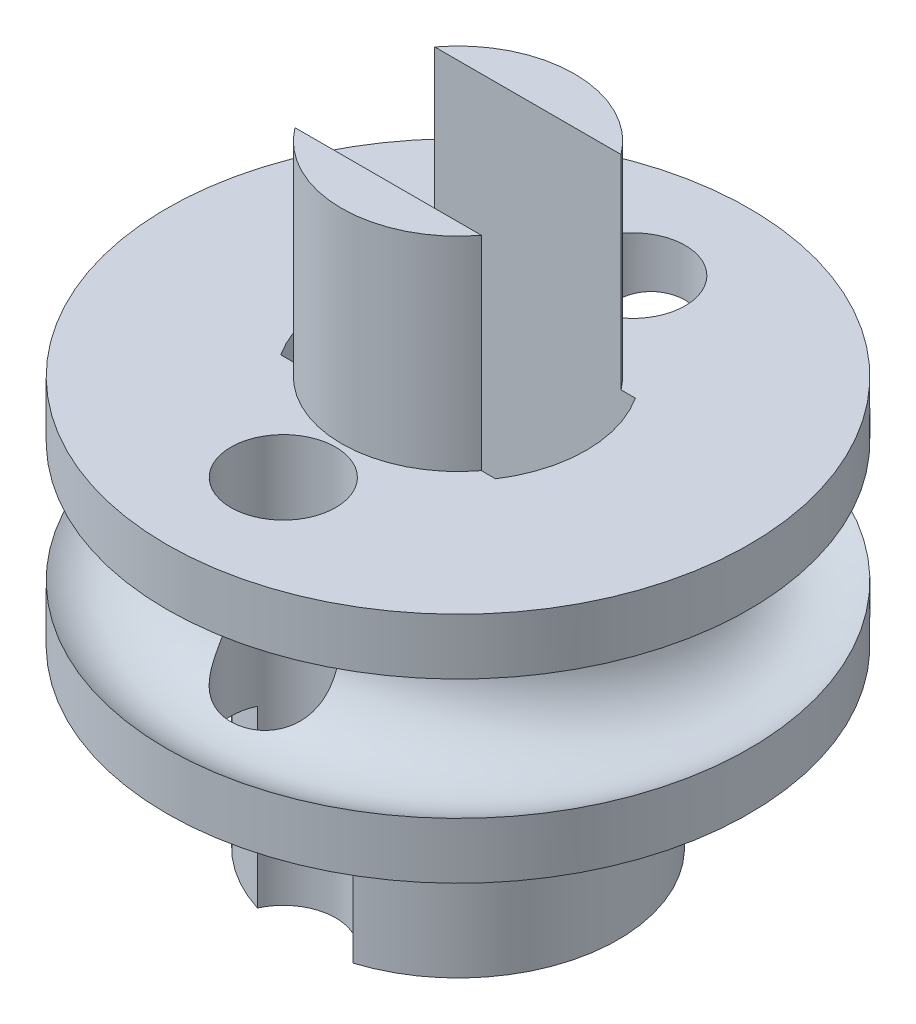
ISO-10303-21;
HEADER;
FILE_DESCRIPTION(('STEP AP214'),'2;1');
FILE_NAME('part.step','',(''),(''),'','','');
FILE_SCHEMA(('AUTOMOTIVE_DESIGN { 1 0 10303 214 1 1 1 1 }'));
ENDSEC;
DATA;
#1=APPLICATION_CONTEXT('core data for automotive mechanical design processes');
#2=APPLICATION_PROTOCOL_DEFINITION('international standard','automotive_design',2000,#1);
#3=PRODUCT_CONTEXT('',#1,'mechanical');
#4=PRODUCT('Part','Part','',(#3));
#5=PRODUCT_RELATED_PRODUCT_CATEGORY('part','',(#4));
#6=PRODUCT_DEFINITION_FORMATION('','',#4);
#7=PRODUCT_DEFINITION_CONTEXT('part definition',#1,'design');
#8=PRODUCT_DEFINITION('design','',#6,#7);
#9=PRODUCT_DEFINITION_SHAPE('','',#8);
#10=(LENGTH_UNIT() NAMED_UNIT(*) SI_UNIT(.MILLI.,.METRE.));
#11=(NAMED_UNIT(*) PLANE_ANGLE_UNIT() SI_UNIT($,.RADIAN.));
#12=(NAMED_UNIT(*) SI_UNIT($,.STERADIAN.) SOLID_ANGLE_UNIT());
#13=UNCERTAINTY_MEASURE_WITH_UNIT(LENGTH_MEASURE(1.E-05),#10,'distance_accuracy_value','');
#14=(GEOMETRIC_REPRESENTATION_CONTEXT(3) GLOBAL_UNCERTAINTY_ASSIGNED_CONTEXT((#13)) GLOBAL_UNIT_ASSIGNED_CONTEXT((#10,
#11,#12)) REPRESENTATION_CONTEXT('',''));
#15=CARTESIAN_POINT('',(0.,0.,0.));
#16=DIRECTION('',(0.,0.,1.));
#17=DIRECTION('',(1.,0.,0.));
#18=AXIS2_PLACEMENT_3D('',#15,#16,#17);
#19=CARTESIAN_POINT('',(0.,3.,0.));
#20=DIRECTION('',(0.,1.,0.));
#21=DIRECTION('',(0.,0.,1.));
#22=AXIS2_PLACEMENT_3D('',#19,#20,#21);
#23=PLANE('',#22);
#24=CARTESIAN_POINT('',(0.,3.,0.));
#25=DIRECTION('',(0.,1.,0.));
#26=DIRECTION('',(0.,0.,1.));
#27=AXIS2_PLACEMENT_3D('',#24,#25,#26);
#28=CIRCLE('',#27,5.);
#29=CARTESIAN_POINT('',(0.,3.,5.));
#30=VERTEX_POINT('',#29);
#31=EDGE_CURVE('E268',#30,#30,#28,.T.);
#32=ORIENTED_EDGE('',*,*,#31,.F.);
#33=EDGE_LOOP('',(#32));
#34=FACE_BOUND('',#33,.T.);
#35=CARTESIAN_POINT('',(0.,3.,3.));
#36=DIRECTION('',(0.,-1.,0.));
#37=DIRECTION('',(0.,0.,-1.));
#38=AXIS2_PLACEMENT_3D('',#35,#36,#37);
#39=CIRCLE('',#38,0.9);
#40=CARTESIAN_POINT('',(0.818344259092032,3.,2.62541666666667));
#41=VERTEX_POINT('',#40);
#42=CARTESIAN_POINT('',(-0.818344259092034,3.,2.62541666666667));
#43=VERTEX_POINT('',#42);
#44=EDGE_CURVE('E162',#41,#43,#39,.T.);
#45=ORIENTED_EDGE('',*,*,#44,.F.);
#46=CARTESIAN_POINT('',(0.,3.,0.));
#47=DIRECTION('',(0.,1.,0.));
#48=DIRECTION('',(0.,0.,1.));
#49=AXIS2_PLACEMENT_3D('',#46,#47,#48);
#50=CIRCLE('',#49,2.75);
#51=CARTESIAN_POINT('',(0.818344259092033,3.,-2.62541666666667));
#52=VERTEX_POINT('',#51);
#53=EDGE_CURVE('E176',#41,#52,#50,.T.);
#54=ORIENTED_EDGE('',*,*,#53,.T.);
#55=CARTESIAN_POINT('',(0.,3.,-3.));
#56=DIRECTION('',(0.,-1.,0.));
#57=DIRECTION('',(0.,0.,-1.));
#58=AXIS2_PLACEMENT_3D('',#55,#56,#57);
#59=CIRCLE('',#58,0.9);
#60=CARTESIAN_POINT('',(-0.818344259092033,3.,-2.62541666666667));
#61=VERTEX_POINT('',#60);
#62=EDGE_CURVE('E302',#61,#52,#59,.T.);
#63=ORIENTED_EDGE('',*,*,#62,.F.);
#64=EDGE_CURVE('E178',#61,#43,#50,.T.);
#65=ORIENTED_EDGE('',*,*,#64,.T.);
#66=EDGE_LOOP('',(#45,#54,#63,#65));
#67=FACE_BOUND('',#66,.T.);
#68=ADVANCED_FACE('F59',(#34,#67),#23,.F.);
#69=CARTESIAN_POINT('',(0.,0.,0.));
#70=DIRECTION('',(0.,1.,0.));
#71=DIRECTION('',(0.,0.,1.));
#72=AXIS2_PLACEMENT_3D('',#69,#70,#71);
#73=PLANE('',#72);
#74=CARTESIAN_POINT('',(0.,0.,3.));
#75=DIRECTION('',(0.,1.,0.));
#76=DIRECTION('',(0.,0.,1.));
#77=AXIS2_PLACEMENT_3D('',#74,#75,#76);
#78=CIRCLE('',#77,0.9);
#79=CARTESIAN_POINT('',(0.818344259092032,0.,2.62541666666667));
#80=VERTEX_POINT('',#79);
#81=CARTESIAN_POINT('',(-0.818344259092033,0.,2.62541666666667));
#82=VERTEX_POINT('',#81);
#83=EDGE_CURVE('E83',#80,#82,#78,.T.);
#84=ORIENTED_EDGE('',*,*,#83,.T.);
#85=CARTESIAN_POINT('',(0.,0.,0.));
#86=DIRECTION('',(0.,1.,0.));
#87=DIRECTION('',(0.,0.,1.));
#88=AXIS2_PLACEMENT_3D('',#85,#86,#87);
#89=CIRCLE('',#88,2.75);
#90=CARTESIAN_POINT('',(-0.818344259092033,0.,-2.62541666666667));
#91=VERTEX_POINT('',#90);
#92=EDGE_CURVE('E196',#91,#82,#89,.T.);
#93=ORIENTED_EDGE('',*,*,#92,.F.);
#94=CARTESIAN_POINT('',(0.,0.,-3.));
#95=DIRECTION('',(0.,1.,0.));
#96=DIRECTION('',(0.,0.,1.));
#97=AXIS2_PLACEMENT_3D('',#94,#95,#96);
#98=CIRCLE('',#97,0.9);
#99=CARTESIAN_POINT('',(0.818344259092033,0.,-2.62541666666667));
#100=VERTEX_POINT('',#99);
#101=EDGE_CURVE('E75',#91,#100,#98,.T.);
#102=ORIENTED_EDGE('',*,*,#101,.T.);
#103=EDGE_CURVE('E192',#80,#100,#89,.T.);
#104=ORIENTED_EDGE('',*,*,#103,.F.);
#105=EDGE_LOOP('',(#84,#93,#102,#104));
#106=FACE_BOUND('',#105,.T.);
#107=ADVANCED_FACE('F401',(#106),#73,.F.);
#108=CARTESIAN_POINT('',(0.,7.,0.));
#109=DIRECTION('',(0.,-1.,0.));
#110=DIRECTION('',(0.,0.,-1.));
#111=AXIS2_PLACEMENT_3D('',#108,#109,#110);
#112=CYLINDRICAL_SURFACE('',#111,2.75);
#113=DIRECTION('',(0.,-1.,0.));
#114=VECTOR('',#113,1.);
#115=CARTESIAN_POINT('',(-0.818344259092034,1.5,2.62541666666667));
#116=LINE('',#115,#114);
#117=EDGE_CURVE('E169',#82,#43,#116,.F.);
#118=ORIENTED_EDGE('',*,*,#117,.T.);
#119=ORIENTED_EDGE('',*,*,#64,.F.);
#120=DIRECTION('',(0.,-1.,0.));
#121=VECTOR('',#120,1.);
#122=CARTESIAN_POINT('',(-0.818344259092033,1.5,-2.62541666666667));
#123=LINE('',#122,#121);
#124=EDGE_CURVE('E290',#61,#91,#123,.T.);
#125=ORIENTED_EDGE('',*,*,#124,.T.);
#126=ORIENTED_EDGE('',*,*,#92,.T.);
#127=EDGE_LOOP('',(#118,#119,#125,#126));
#128=FACE_BOUND('',#127,.T.);
#129=ADVANCED_FACE('F61',(#128),#112,.T.);
#130=DIRECTION('',(0.,-1.,0.));
#131=VECTOR('',#130,1.);
#132=CARTESIAN_POINT('',(0.818344259092032,1.5,2.62541666666667));
#133=LINE('',#132,#131);
#134=EDGE_CURVE('E158',#41,#80,#133,.T.);
#135=ORIENTED_EDGE('',*,*,#134,.T.);
#136=ORIENTED_EDGE('',*,*,#103,.T.);
#137=DIRECTION('',(0.,-1.,0.));
#138=VECTOR('',#137,1.);
#139=CARTESIAN_POINT('',(0.818344259092033,1.5,-2.62541666666667));
#140=LINE('',#139,#138);
#141=EDGE_CURVE('E184',#100,#52,#140,.F.);
#142=ORIENTED_EDGE('',*,*,#141,.T.);
#143=ORIENTED_EDGE('',*,*,#53,.F.);
#144=EDGE_LOOP('',(#135,#136,#142,#143));
#145=FACE_BOUND('',#144,.T.);
#146=ADVANCED_FACE('F183',(#145),#112,.T.);
#147=CARTESIAN_POINT('',(0.,5.,0.));
#148=DIRECTION('',(0.,-1.,0.));
#149=DIRECTION('',(0.,0.,-1.));
#150=AXIS2_PLACEMENT_3D('',#147,#148,#149);
#151=TOROIDAL_SURFACE('',#150,4.3,1.25);
#152=CARTESIAN_POINT('',(-0.683529065477994,3.93225998657177,-3.58548105341402));
#153=CARTESIAN_POINT('',(-0.712384372251249,3.94911904604806,-3.5517874791948));
#154=CARTESIAN_POINT('',(-0.738160552704805,3.96839167932476,-3.5166141374605));
#155=CARTESIAN_POINT('',(-0.783223917138607,4.01217612628106,-3.4453574338248));
#156=CARTESIAN_POINT('',(-0.802505329037138,4.03669256881383,-3.40927329291961));
#157=CARTESIAN_POINT('',(-0.83485711744434,4.09086620262035,-3.33841930497334));
#158=CARTESIAN_POINT('',(-0.847946637716012,4.12050715693041,-3.30364571699467));
#159=CARTESIAN_POINT('',(-0.868918451931517,4.18455023754195,-3.23707072016033));
#160=CARTESIAN_POINT('',(-0.876799709231551,4.21895331004025,-3.20526990408088));
#161=CARTESIAN_POINT('',(-0.888917712896388,4.29370014679972,-3.14436519786418));
#162=CARTESIAN_POINT('',(-0.892945126023242,4.33425900699732,-3.1154855326065));
#163=CARTESIAN_POINT('',(-0.898160246728364,4.41894239135499,-3.06323645490398));
#164=CARTESIAN_POINT('',(-0.899346296623299,4.4630689814593,-3.03987026624564));
#165=CARTESIAN_POINT('',(-0.900309698064023,4.56184222321523,-2.99551307543839));
#166=CARTESIAN_POINT('',(-0.899808328626254,4.61698943363633,-2.97562954188469));
#167=CARTESIAN_POINT('',(-0.898404520797892,4.72960366652736,-2.94417975626337));
#168=CARTESIAN_POINT('',(-0.897501850711853,4.78707201167887,-2.93261831916625));
#169=CARTESIAN_POINT('',(-0.896192415170599,4.91096499371717,-2.91683840728801));
#170=CARTESIAN_POINT('',(-0.895869492729777,4.97754740700427,-2.91382823136743));
#171=CARTESIAN_POINT('',(-0.896311309223705,5.11036055270444,-2.91857710772705));
#172=CARTESIAN_POINT('',(-0.89707678129111,5.17659101787748,-2.9263434188661));
#173=CARTESIAN_POINT('',(-0.898882268024028,5.30912707596461,-2.95311021647043));
#174=CARTESIAN_POINT('',(-0.899930794646132,5.37535741246939,-2.97248669167955));
#175=CARTESIAN_POINT('',(-0.900062607143723,5.50334701111266,-3.02263873830645));
#176=CARTESIAN_POINT('',(-0.899148309023287,5.56511167322846,-3.05340025751331));
#177=CARTESIAN_POINT('',(-0.892774391021973,5.6684376713856,-3.11714756229579));
#178=CARTESIAN_POINT('',(-0.888406228315029,5.71138226517702,-3.14800216961783));
#179=CARTESIAN_POINT('',(-0.874632586906839,5.7921220028515,-3.2148947074066));
#180=CARTESIAN_POINT('',(-0.86523225441683,5.82992235810932,-3.25092731503541));
#181=CARTESIAN_POINT('',(-0.839597589788949,5.89969386418097,-3.32661506224949));
#182=CARTESIAN_POINT('',(-0.823317136289574,5.9316235482638,-3.36629320852634));
#183=CARTESIAN_POINT('',(-0.782784581777963,5.98884206901621,-3.44637971240496));
#184=CARTESIAN_POINT('',(-0.758535327609385,6.01413327147921,-3.48678780436976));
#185=CARTESIAN_POINT('',(-0.705240569186079,6.05572982639452,-3.56077634387997));
#186=CARTESIAN_POINT('',(-0.677080505975519,6.07273804791814,-3.59460438551796));
#187=CARTESIAN_POINT('',(-0.614937604022408,6.10230448402068,-3.65866701507885));
#188=CARTESIAN_POINT('',(-0.580954625721143,6.1148625919209,-3.68890151684539));
#189=CARTESIAN_POINT('',(-0.508788451271447,6.13602183768982,-3.74373967588384));
#190=CARTESIAN_POINT('',(-0.470703537097934,6.14469751650289,-3.76844439969858));
#191=CARTESIAN_POINT('',(-0.39081496102553,6.15912969553288,-3.81199410831929));
#192=CARTESIAN_POINT('',(-0.349010898324905,6.16488588067552,-3.83083846058405));
#193=CARTESIAN_POINT('',(-0.26132268964809,6.17418740133938,-3.86252958942446));
#194=CARTESIAN_POINT('',(-0.215348061449364,6.17765073486162,-3.87515016375587));
#195=CARTESIAN_POINT('',(-0.121873469678644,6.1824572942273,-3.89297925438845));
#196=CARTESIAN_POINT('',(-0.074373253905187,6.18380016766845,-3.8981865386502));
#197=CARTESIAN_POINT('',(0.0219849468171089,6.18454557543174,-3.90105126684519));
#198=CARTESIAN_POINT('',(0.0708487211831386,6.18390203275111,-3.89852943534955));
#199=CARTESIAN_POINT('',(0.167455104368015,6.18048693490875,-3.88562618755484));
#200=CARTESIAN_POINT('',(0.215197641722204,6.17771524448187,-3.87524427166913));
#201=CARTESIAN_POINT('',(0.308313805179474,6.16967741783157,-3.84694496782944));
#202=CARTESIAN_POINT('',(0.353681063543777,6.16440492306475,-3.82900838447781));
#203=CARTESIAN_POINT('',(0.440564322638171,6.15076176396243,-3.78628547950806));
#204=CARTESIAN_POINT('',(0.482080823269948,6.14239150248203,-3.76150004866779));
#205=CARTESIAN_POINT('',(0.559281149755411,6.12196935452311,-3.70668456554567));
#206=CARTESIAN_POINT('',(0.595059252289957,6.10998898361859,-3.67676085664589));
#207=CARTESIAN_POINT('',(0.660690623440795,6.08152709322511,-3.61284848405536));
#208=CARTESIAN_POINT('',(0.690546573292088,6.06504761875816,-3.57886167114321));
#209=CARTESIAN_POINT('',(0.742796466223733,6.02763930645181,-3.50995880034237));
#210=CARTESIAN_POINT('',(0.765415843607655,6.00688725844297,-3.47511741697579));
#211=CARTESIAN_POINT('',(0.804539597806473,5.96037723142798,-3.40535967627958));
#212=CARTESIAN_POINT('',(0.821044508208093,5.93461968953183,-3.37044332575966));
#213=CARTESIAN_POINT('',(0.84846716498164,5.87826625564342,-3.30240938606911));
#214=CARTESIAN_POINT('',(0.859386108446973,5.84767140214625,-3.26929141286053));
#215=CARTESIAN_POINT('',(0.876638244423291,5.78213946169484,-3.20633391094712));
#216=CARTESIAN_POINT('',(0.882969420519613,5.74720047330171,-3.17649582870097));
#217=CARTESIAN_POINT('',(0.892729772681046,5.66993539734701,-3.11829405513934));
#218=CARTESIAN_POINT('',(0.895797758952668,5.62721937416451,-3.09038995470626));
#219=CARTESIAN_POINT('',(0.899435526343155,5.53835842050623,-3.04052015306525));
#220=CARTESIAN_POINT('',(0.900003673015622,5.49221126672824,-3.01855834585306));
#221=CARTESIAN_POINT('',(0.899995589909844,5.38913938750857,-2.97758715108374));
#222=CARTESIAN_POINT('',(0.899201851506435,5.33174121710634,-2.95976577604482));
#223=CARTESIAN_POINT('',(0.897594060743449,5.21492694218061,-2.93288224134686));
#224=CARTESIAN_POINT('',(0.896779997967903,5.15550979708542,-2.92382467163224));
#225=CARTESIAN_POINT('',(0.895892348131258,5.02879392829446,-2.91391822510708));
#226=CARTESIAN_POINT('',(0.895919280555601,4.96140461262189,-2.91418415364076));
#227=CARTESIAN_POINT('',(0.896947801993345,4.82753787098253,-2.92572955313467));
#228=CARTESIAN_POINT('',(0.897950081874669,4.76106112526576,-2.93701683086714));
#229=CARTESIAN_POINT('',(0.899696407291281,4.62951026790577,-2.97096524947187));
#230=CARTESIAN_POINT('',(0.900434397037047,4.56449761467536,-2.99386717154402));
#231=CARTESIAN_POINT('',(0.899009063348626,4.43964568650051,-3.05089052511082));
#232=CARTESIAN_POINT('',(0.896850522010035,4.37979805771675,-3.08499339399498));
#233=CARTESIAN_POINT('',(0.887337730216563,4.28175482335089,-3.15328280758183));
#234=CARTESIAN_POINT('',(0.881426825233136,4.24189935494769,-3.18529097206886));
#235=CARTESIAN_POINT('',(0.864238011828089,4.16738997348754,-3.25363303523872));
#236=CARTESIAN_POINT('',(0.85296534887976,4.13273102010862,-3.28996268017073));
#237=CARTESIAN_POINT('',(0.823554690550721,4.06915083800823,-3.36523237022096));
#238=CARTESIAN_POINT('',(0.805377629557861,4.04026371309307,-3.40418621183316));
#239=CARTESIAN_POINT('',(0.761399801001322,3.98872047825646,-3.48193369215689));
#240=CARTESIAN_POINT('',(0.73559994862972,3.96606362095939,-3.52072734953354));
#241=CARTESIAN_POINT('',(0.67943244730569,3.92854378354301,-3.59179426187164));
#242=CARTESIAN_POINT('',(0.649762049604268,3.91313396509677,-3.62433373526263));
#243=CARTESIAN_POINT('',(0.584956315888217,3.88646627410722,-3.68542599769737));
#244=CARTESIAN_POINT('',(0.549820779334464,3.87520855397313,-3.71397864037439));
#245=CARTESIAN_POINT('',(0.475207414373186,3.85619242170648,-3.76565551707034));
#246=CARTESIAN_POINT('',(0.435752746589956,3.84841638316985,-3.7888068037331));
#247=CARTESIAN_POINT('',(0.353421697570534,3.8356249382442,-3.8289705904111));
#248=CARTESIAN_POINT('',(0.310544869956429,3.83060989266817,-3.84598228799054));
#249=CARTESIAN_POINT('',(0.220971558453662,3.82269508267826,-3.8737539869472));
#250=CARTESIAN_POINT('',(0.174194053349283,3.81987507061762,-3.88427562484073));
#251=CARTESIAN_POINT('',(0.0794830747793391,3.81629794531794,-3.89775914331294));
#252=CARTESIAN_POINT('',(0.0315494475090345,3.81554110809761,-3.90072001238231));
#253=CARTESIAN_POINT('',(-0.0651375997590904,3.81599640866251,-3.89896683491212));
#254=CARTESIAN_POINT('',(-0.113888093441761,3.81724849801105,-3.89409705583312));
#255=CARTESIAN_POINT('',(-0.209867546318683,3.82196637079468,-3.8765475402345));
#256=CARTESIAN_POINT('',(-0.257096126282473,3.82543270156186,-3.86386587274391));
#257=CARTESIAN_POINT('',(-0.348653818161833,3.83501221619168,-3.8311465180398));
#258=CARTESIAN_POINT('',(-0.392982663174846,3.84112564330957,-3.81110815480752));
#259=CARTESIAN_POINT('',(-0.477370793180658,3.8566578817625,-3.76448217212127));
#260=CARTESIAN_POINT('',(-0.517435761249942,3.86607221971932,-3.73790343061912));
#261=CARTESIAN_POINT('',(-0.578607232130902,3.88484463596485,-3.69002473003814));
#262=CARTESIAN_POINT('',(-0.601333312445885,3.89299402878564,-3.67028725224378));
#263=CARTESIAN_POINT('',(-0.644324695414218,3.91116908522294,-3.62907263925119));
#264=CARTESIAN_POINT('',(-0.664590101857192,3.92119466965757,-3.60759557749123));
#265=CARTESIAN_POINT('',(-0.683529065477994,3.93225998657177,-3.58548105341402));
#266=B_SPLINE_CURVE_WITH_KNOTS('',3,(#152,#153,#154,#155,#156,#157,#158,#159,#160,#161,#162,
#163,#164,#165,#166,#167,#168,#169,#170,#171,#172,#173,#174,#175,#176,#177,#178,#179,#180,#181,
#182,#183,#184,#185,#186,#187,#188,#189,#190,#191,#192,#193,#194,#195,#196,#197,#198,#199,#200,
#201,#202,#203,#204,#205,#206,#207,#208,#209,#210,#211,#212,#213,#214,#215,#216,#217,#218,#219,
#220,#221,#222,#223,#224,#225,#226,#227,#228,#229,#230,#231,#232,#233,#234,#235,#236,#237,#238,
#239,#240,#241,#242,#243,#244,#245,#246,#247,#248,#249,#250,#251,#252,#253,#254,#255,#256,#257,
#258,#259,#260,#261,#262,#263,#264,#265),.UNSPECIFIED.,.T.,.F.,(4,2,2,2,2,2,2,2,2,2,2,2,2,2,2,2,
2,2,2,2,2,2,2,2,2,2,2,2,2,2,2,2,2,2,2,2,2,2,2,2,2,2,2,2,2,2,2,2,2,2,2,2,2,2,2,2,4),(0.,
0.142247061562533,0.284620210545315,0.426550253323867,0.568508537114953,0.717801170750642,
0.867180882202964,1.04236376814645,1.21764792952177,1.41670077146508,1.61588775713116,
1.82190301316875,2.02766483430376,2.18619812105413,2.3445695906191,2.50401998966861,
2.66341348708441,2.80427487778045,2.94513964499577,3.08316978823671,3.221214824642,
3.36396288439519,3.50673466515664,3.65284286975896,3.79896036177264,3.94545138003948,
4.09192335428696,4.23566575697625,4.37934293147793,4.51796898357992,4.65658293545223,
4.79516716938445,4.93381227694958,5.08657657364059,5.23944073593398,5.4190382875391,
5.59872985050695,5.79997285984113,6.0013585194841,6.20710099032164,6.4125042034001,
6.56624549895306,6.71983669591344,6.87431019065856,7.0287651468521,7.16805423815501,
7.30734844177174,7.44592925072315,7.58452816544082,7.72795409872416,7.87139921908641,
8.01773256504729,8.16410209673895,8.31048508193304,8.45667045151591,8.55003718025107,
8.6433999694693),.UNSPECIFIED.);
#267=CARTESIAN_POINT('',(0.,6.1842719282327,-3.9));
#268=VERTEX_POINT('',#267);
#269=CARTESIAN_POINT('',(0.,3.8157280717673,-3.9));
#270=VERTEX_POINT('',#269);
#271=EDGE_CURVE('E293',#268,#270,#266,.T.);
#272=ORIENTED_EDGE('',*,*,#271,.F.);
#273=CARTESIAN_POINT('',(0.,5.,-4.3));
#274=DIRECTION('',(1.,0.,0.));
#275=DIRECTION('',(0.,0.,-1.));
#276=AXIS2_PLACEMENT_3D('',#273,#274,#275);
#277=CIRCLE('',#276,1.25);
#278=CARTESIAN_POINT('',(0.,6.0356157588604,-5.));
#279=VERTEX_POINT('',#278);
#280=EDGE_CURVE('E278',#279,#268,#277,.T.);
#281=ORIENTED_EDGE('',*,*,#280,.F.);
#282=CARTESIAN_POINT('',(0.,6.0356157588604,0.));
#283=DIRECTION('',(0.,-1.,0.));
#284=DIRECTION('',(0.,0.,-1.));
#285=AXIS2_PLACEMENT_3D('',#282,#283,#284);
#286=CIRCLE('',#285,5.);
#287=EDGE_CURVE('E68',#279,#279,#286,.T.);
#288=ORIENTED_EDGE('',*,*,#287,.T.);
#289=ORIENTED_EDGE('',*,*,#280,.T.);
#290=EDGE_CURVE('E294',#270,#268,#266,.T.);
#291=ORIENTED_EDGE('',*,*,#290,.F.);
#292=CARTESIAN_POINT('',(0.,3.9643842411396,-5.));
#293=VERTEX_POINT('',#292);
#294=EDGE_CURVE('E285',#270,#293,#277,.T.);
#295=ORIENTED_EDGE('',*,*,#294,.T.);
#296=CARTESIAN_POINT('',(0.,3.9643842411396,0.));
#297=DIRECTION('',(0.,1.,0.));
#298=DIRECTION('',(0.,0.,1.));
#299=AXIS2_PLACEMENT_3D('',#296,#297,#298);
#300=CIRCLE('',#299,5.);
#301=EDGE_CURVE('E13',#293,#293,#300,.T.);
#302=ORIENTED_EDGE('',*,*,#301,.T.);
#303=ORIENTED_EDGE('',*,*,#294,.F.);
#304=EDGE_LOOP('',(#272,#281,#288,#289,#291,#295,#302,#303));
#305=FACE_BOUND('',#304,.T.);
#306=CARTESIAN_POINT('',(-0.899698996502388,4.50011389048363,3.02327478678477));
#307=CARTESIAN_POINT('',(-0.899095611163397,4.4491986952061,3.0466356247286));
#308=CARTESIAN_POINT('',(-0.897503389327882,4.39997592280431,3.073729141319));
#309=CARTESIAN_POINT('',(-0.890379219880051,4.3062397368398,3.13477931071432));
#310=CARTESIAN_POINT('',(-0.884846708011505,4.2617269988107,3.16873694597386));
#311=CARTESIAN_POINT('',(-0.867567288419561,4.1783992819848,3.24241410727429));
#312=CARTESIAN_POINT('',(-0.855771461463111,4.13963227199478,3.28217717859073));
#313=CARTESIAN_POINT('',(-0.823980337481586,4.06931672105759,3.36468751006908));
#314=CARTESIAN_POINT('',(-0.803995064118726,4.03775942889653,3.40743106930677));
#315=CARTESIAN_POINT('',(-0.758193648040856,3.985874636044,3.48677754552836));
#316=CARTESIAN_POINT('',(-0.733524417310282,3.96460733379186,3.52343260078298));
#317=CARTESIAN_POINT('',(-0.67747096208614,3.92730487767293,3.59419526173346));
#318=CARTESIAN_POINT('',(-0.646086399852338,3.91126998706701,3.62830273918525));
#319=CARTESIAN_POINT('',(-0.579439001767479,3.88458791326115,3.69006563302307));
#320=CARTESIAN_POINT('',(-0.544528344440014,3.8736722709719,3.71798735999925));
#321=CARTESIAN_POINT('',(-0.470337207768503,3.85516598363622,3.76863562886258));
#322=CARTESIAN_POINT('',(-0.431056618379417,3.84757542234683,3.79136203987555));
#323=CARTESIAN_POINT('',(-0.348074053238659,3.83492161826316,3.83127683032442));
#324=CARTESIAN_POINT('',(-0.304281877008215,3.82993145843396,3.84830070008628));
#325=CARTESIAN_POINT('',(-0.21439272958904,3.82226070945085,3.87535142634201));
#326=CARTESIAN_POINT('',(-0.168295333119999,3.81958054813426,3.88537698660612));
#327=CARTESIAN_POINT('',(-0.0736369424898305,3.81615961988808,3.89829078293821));
#328=CARTESIAN_POINT('',(-0.0250434602833754,3.81547895884983,3.90095767477128));
#329=CARTESIAN_POINT('',(0.0719281478311253,3.81613591247935,3.8984316177833));
#330=CARTESIAN_POINT('',(0.120306252584801,3.81747372119826,3.89323791326208));
#331=CARTESIAN_POINT('',(0.215932587814956,3.82236778821372,3.87507869543276));
#332=CARTESIAN_POINT('',(0.263166343006426,3.82594432750169,3.86204217535759));
#333=CARTESIAN_POINT('',(0.354659365153473,3.8357813996042,3.82860604188281));
#334=CARTESIAN_POINT('',(0.398918739218475,3.84204183570987,3.80820669379219));
#335=CARTESIAN_POINT('',(0.482661331371342,3.85783163808632,3.76112975576736));
#336=CARTESIAN_POINT('',(0.522192552871183,3.86732355084513,3.73452515203801));
#337=CARTESIAN_POINT('',(0.595864901423131,3.89037441924588,3.67612984857534));
#338=CARTESIAN_POINT('',(0.630008081788851,3.90393181984209,3.64434113387715));
#339=CARTESIAN_POINT('',(0.690999044342911,3.93535841220121,3.57833720990449));
#340=CARTESIAN_POINT('',(0.71804739619448,3.95307362813875,3.54423402568598));
#341=CARTESIAN_POINT('',(0.765841608690348,3.99350725209505,3.47462485620555));
#342=CARTESIAN_POINT('',(0.786589307356202,4.01622419767095,3.43911928346939));
#343=CARTESIAN_POINT('',(0.821584315022366,4.06625064147815,3.36944619484737));
#344=CARTESIAN_POINT('',(0.835956593699966,4.09345602401766,3.33526617919711));
#345=CARTESIAN_POINT('',(0.859512752192153,4.15249136033627,3.26920358751444));
#346=CARTESIAN_POINT('',(0.868695006060548,4.18432275944557,3.23732173418322));
#347=CARTESIAN_POINT('',(0.883393106923081,4.25422857773747,3.17522110413391));
#348=CARTESIAN_POINT('',(0.888632986982967,4.29257380787096,3.14524376169107));
#349=CARTESIAN_POINT('',(0.895881584886582,4.37300398727429,3.0903570688253));
#350=CARTESIAN_POINT('',(0.897888359239453,4.41509116988817,3.06545077457272));
#351=CARTESIAN_POINT('',(0.900197894212943,4.50920881774369,3.0176142907609));
#352=CARTESIAN_POINT('',(0.900171002149776,4.56174408326436,2.99566187045126));
#353=CARTESIAN_POINT('',(0.899272181025074,4.66942624774059,2.95956948859044));
#354=CARTESIAN_POINT('',(0.89839973682566,4.72457471926531,2.94543429779547));
#355=CARTESIAN_POINT('',(0.896822738216467,4.84478414185531,2.92349247888979));
#356=CARTESIAN_POINT('',(0.896163546925316,4.91008257137235,2.916966687075));
#357=CARTESIAN_POINT('',(0.895915578263289,5.0409181208351,2.91435490099587));
#358=CARTESIAN_POINT('',(0.896327475803853,5.10645536528102,2.9182754892131));
#359=CARTESIAN_POINT('',(0.897847371558955,5.23929357390984,2.93702805074315));
#360=CARTESIAN_POINT('',(0.89898901240696,5.30651984840264,2.95239366119422));
#361=CARTESIAN_POINT('',(0.900230505130162,5.43727858716751,2.99460510983751));
#362=CARTESIAN_POINT('',(0.900331193577191,5.50081397681204,3.02144171118602));
#363=CARTESIAN_POINT('',(0.896845663434568,5.60979125983945,3.0795588643154));
#364=CARTESIAN_POINT('',(0.893994472949981,5.65630706240398,3.10887018744043));
#365=CARTESIAN_POINT('',(0.883698089878675,5.74428688671777,3.17363496005368));
#366=CARTESIAN_POINT('',(0.876257448471462,5.78575586448816,3.20908229967342));
#367=CARTESIAN_POINT('',(0.854671986989271,5.86280909994145,3.2847631071786));
#368=CARTESIAN_POINT('',(0.840474749837011,5.89834436123489,3.32503212087178));
#369=CARTESIAN_POINT('',(0.803774906602838,5.96232903707974,3.40739062714583));
#370=CARTESIAN_POINT('',(0.781278029953815,5.99078331715869,3.44947884623396));
#371=CARTESIAN_POINT('',(0.731122311664602,6.03725202994807,3.52657853165517));
#372=CARTESIAN_POINT('',(0.704569271469263,6.05615700007324,3.56177870953828));
#373=CARTESIAN_POINT('',(0.645226996528923,6.08916163637375,3.62904035096607));
#374=CARTESIAN_POINT('',(0.612437695731511,6.10326125164794,3.66110178126071));
#375=CARTESIAN_POINT('',(0.542838300747315,6.1268919303443,3.71923889545423));
#376=CARTESIAN_POINT('',(0.506234359997512,6.13657944208313,3.74549897691601));
#377=CARTESIAN_POINT('',(0.429000434295451,6.15285348150855,3.79246587303216));
#378=CARTESIAN_POINT('',(0.388370159822312,6.15943978600103,3.81317228794261));
#379=CARTESIAN_POINT('',(0.302825955444365,6.17027270706718,3.84882952877824));
#380=CARTESIAN_POINT('',(0.257817035444663,6.17443849312828,3.86357698233781));
#381=CARTESIAN_POINT('',(0.165898691777908,6.18057069157775,3.88584148759149));
#382=CARTESIAN_POINT('',(0.11898893084034,6.18253671187037,3.89335725024438));
#383=CARTESIAN_POINT('',(0.0232728491296895,6.18453952774943,3.90101259511243));
#384=CARTESIAN_POINT('',(-0.0255507649533789,6.18452373866939,3.90095112636139));
#385=CARTESIAN_POINT('',(-0.122506625424191,6.18242971236153,3.89294937511473));
#386=CARTESIAN_POINT('',(-0.170638817068075,6.1803513127282,3.88500847220944));
#387=CARTESIAN_POINT('',(-0.265116856699044,6.17384122416664,3.86144996145769));
#388=CARTESIAN_POINT('',(-0.311451044640776,6.16939627481223,3.84578913378246));
#389=CARTESIAN_POINT('',(-0.400676312370961,6.15761294155392,3.80735170343514));
#390=CARTESIAN_POINT('',(-0.443567671109539,6.15027479235263,3.78457567799436));
#391=CARTESIAN_POINT('',(-0.523999336021723,6.13210891445565,3.73325653847899));
#392=CARTESIAN_POINT('',(-0.561610613718473,6.12133550609995,3.70480562149879));
#393=CARTESIAN_POINT('',(-0.631136367401425,6.09548246560744,3.64328734305943));
#394=CARTESIAN_POINT('',(-0.66305328318972,6.08040468495365,3.61022196958195));
#395=CARTESIAN_POINT('',(-0.71944932170451,6.04585073404647,3.54246569953527));
#396=CARTESIAN_POINT('',(-0.744146699169178,6.02654388080228,3.50786997118067));
#397=CARTESIAN_POINT('',(-0.787309699612284,5.98290573253411,3.4379848265393));
#398=CARTESIAN_POINT('',(-0.805776506782051,5.95857539369977,3.40269554342136));
#399=CARTESIAN_POINT('',(-0.836672831079578,5.90522106727514,3.33375559385699));
#400=CARTESIAN_POINT('',(-0.849166310781656,5.87625145593862,3.30009120531292));
#401=CARTESIAN_POINT('',(-0.869276290187118,5.81383336999316,3.23559063065041));
#402=CARTESIAN_POINT('',(-0.876890870540901,5.78038313896602,3.2047555616629));
#403=CARTESIAN_POINT('',(-0.888876350126876,5.70666380083949,3.14463350755634));
#404=CARTESIAN_POINT('',(-0.89291916171023,5.66605743805036,3.1156969486551));
#405=CARTESIAN_POINT('',(-0.898153755890385,5.58126776783883,3.06335000667544));
#406=CARTESIAN_POINT('',(-0.899343874414158,5.53708238818079,3.03994285626165));
#407=CARTESIAN_POINT('',(-0.900309765890747,5.43826498716359,2.99555583317556));
#408=CARTESIAN_POINT('',(-0.899809410430916,5.38313727374901,2.97567246810444));
#409=CARTESIAN_POINT('',(-0.89840687237533,5.27054548759755,2.94421387004013));
#410=CARTESIAN_POINT('',(-0.897504347004534,5.2130794599295,2.93264574626822));
#411=CARTESIAN_POINT('',(-0.896192585990391,5.08914574621821,2.91684329247177));
#412=CARTESIAN_POINT('',(-0.895867469614603,5.02251977633058,2.9138251277559));
#413=CARTESIAN_POINT('',(-0.896312914948094,4.88969715672245,2.91857574506003));
#414=CARTESIAN_POINT('',(-0.897082571396996,4.823500197709,2.92633561467024));
#415=CARTESIAN_POINT('',(-0.898563112303811,4.7139488683735,2.94844259719843));
#416=CARTESIAN_POINT('',(-0.899215452922015,4.6699980065053,2.95992626380201));
#417=CARTESIAN_POINT('',(-0.900027733584353,4.58369937288521,2.98788216970379));
#418=CARTESIAN_POINT('',(-0.900187695163532,4.54135153110249,3.00435419079309));
#419=CARTESIAN_POINT('',(-0.899698996502388,4.50011389048363,3.02327478678477));
#420=B_SPLINE_CURVE_WITH_KNOTS('',3,(#306,#307,#308,#309,#310,#311,#312,#313,#314,#315,#316,
#317,#318,#319,#320,#321,#322,#323,#324,#325,#326,#327,#328,#329,#330,#331,#332,#333,#334,#335,
#336,#337,#338,#339,#340,#341,#342,#343,#344,#345,#346,#347,#348,#349,#350,#351,#352,#353,#354,
#355,#356,#357,#358,#359,#360,#361,#362,#363,#364,#365,#366,#367,#368,#369,#370,#371,#372,#373,
#374,#375,#376,#377,#378,#379,#380,#381,#382,#383,#384,#385,#386,#387,#388,#389,#390,#391,#392,
#393,#394,#395,#396,#397,#398,#399,#400,#401,#402,#403,#404,#405,#406,#407,#408,#409,#410,#411,
#412,#413,#414,#415,#416,#417,#418,#419),.UNSPECIFIED.,.T.,.F.,(4,2,2,2,2,2,2,2,2,2,2,2,2,2,2,2,
2,2,2,2,2,2,2,2,2,2,2,2,2,2,2,2,2,2,2,2,2,2,2,2,2,2,2,2,2,2,2,2,2,2,2,2,2,2,2,2,4),(0.,
0.167929326638648,0.335882705878751,0.505167598639596,0.674245907216324,0.820566266794585,
0.966893987125365,1.10431809815042,1.24174567061748,1.38285157035913,1.52398359886335,
1.66931677953835,1.81466393310831,1.96134725274822,2.10802528739153,2.25305811078039,
2.39803552984241,2.53831451368656,2.6785525360591,2.81590497991482,2.95330043013072,
3.09959421409201,3.24597590569265,3.41612965272939,3.58638712817192,3.78240048773811,
3.97853738860788,4.18444141080207,4.39017994328898,4.55467630973987,4.7190098132376,
4.88463951645744,5.05015509496302,5.19334182643651,5.33653007458104,5.47414552265256,
5.61177087340452,5.75376113860974,5.89577670874283,6.04156124877236,6.18735726847325,
6.3339789562086,6.48058875212258,6.62498653690889,6.76932230376638,6.90868840755262,
7.04802800827165,7.18584014669153,7.32370646690781,7.47321112649013,7.62280297603154,
7.79793190987041,7.97321039490178,8.17240708034769,8.371439147099,8.50745575428884,
8.6434664124734),.UNSPECIFIED.);
#421=CARTESIAN_POINT('',(-0.899698996502388,4.50011389048363,3.02327478678477));
#422=VERTEX_POINT('',#421);
#423=EDGE_CURVE('E170',#422,#422,#420,.T.);
#424=ORIENTED_EDGE('',*,*,#423,.F.);
#425=EDGE_LOOP('',(#424));
#426=FACE_BOUND('',#425,.T.);
#427=ADVANCED_FACE('F343',(#305,#426),#151,.F.);
#428=CARTESIAN_POINT('',(0.,3.,0.));
#429=DIRECTION('',(0.,1.,0.));
#430=DIRECTION('',(0.,0.,1.));
#431=AXIS2_PLACEMENT_3D('',#428,#429,#430);
#432=CYLINDRICAL_SURFACE('',#431,5.);
#433=ORIENTED_EDGE('',*,*,#301,.F.);
#434=EDGE_LOOP('',(#433));
#435=FACE_BOUND('',#434,.T.);
#436=ORIENTED_EDGE('',*,*,#31,.T.);
#437=EDGE_LOOP('',(#436));
#438=FACE_BOUND('',#437,.T.);
#439=ADVANCED_FACE('F388',(#435,#438),#432,.T.);
#440=CARTESIAN_POINT('',(0.,10.5,0.));
#441=DIRECTION('',(0.,1.,0.));
#442=DIRECTION('',(0.,0.,1.));
#443=AXIS2_PLACEMENT_3D('',#440,#441,#442);
#444=PLANE('',#443);
#445=DIRECTION('',(1.,0.,0.));
#446=VECTOR('',#445,1.);
#447=CARTESIAN_POINT('',(0.,10.5,-1.2));
#448=LINE('',#447,#446);
#449=CARTESIAN_POINT('',(-1.6,10.5,-1.2));
#450=VERTEX_POINT('',#449);
#451=CARTESIAN_POINT('',(1.6,10.5,-1.2));
#452=VERTEX_POINT('',#451);
#453=EDGE_CURVE('E250',#450,#452,#448,.T.);
#454=ORIENTED_EDGE('',*,*,#453,.T.);
#455=CARTESIAN_POINT('',(0.,10.5,0.));
#456=DIRECTION('',(0.,1.,0.));
#457=DIRECTION('',(0.,0.,1.));
#458=AXIS2_PLACEMENT_3D('',#455,#456,#457);
#459=CIRCLE('',#458,2.);
#460=EDGE_CURVE('E245',#452,#450,#459,.T.);
#461=ORIENTED_EDGE('',*,*,#460,.T.);
#462=EDGE_LOOP('',(#454,#461));
#463=FACE_BOUND('',#462,.T.);
#464=ADVANCED_FACE('F385',(#463),#444,.T.);
#465=CARTESIAN_POINT('',(0.,10.5,0.));
#466=DIRECTION('',(0.,1.,0.));
#467=DIRECTION('',(0.,0.,1.));
#468=AXIS2_PLACEMENT_3D('',#465,#466,#467);
#469=PLANE('',#468);
#470=DIRECTION('',(-1.,0.,0.));
#471=VECTOR('',#470,1.);
#472=CARTESIAN_POINT('',(0.,10.5,1.2));
#473=LINE('',#472,#471);
#474=CARTESIAN_POINT('',(1.6,10.5,1.2));
#475=VERTEX_POINT('',#474);
#476=CARTESIAN_POINT('',(-1.6,10.5,1.2));
#477=VERTEX_POINT('',#476);
#478=EDGE_CURVE('E267',#475,#477,#473,.T.);
#479=ORIENTED_EDGE('',*,*,#478,.T.);
#480=CARTESIAN_POINT('',(0.,10.5,0.));
#481=DIRECTION('',(0.,1.,0.));
#482=DIRECTION('',(0.,0.,1.));
#483=AXIS2_PLACEMENT_3D('',#480,#481,#482);
#484=CIRCLE('',#483,2.);
#485=EDGE_CURVE('E262',#477,#475,#484,.T.);
#486=ORIENTED_EDGE('',*,*,#485,.T.);
#487=EDGE_LOOP('',(#479,#486));
#488=FACE_BOUND('',#487,.T.);
#489=ADVANCED_FACE('F387',(#488),#469,.T.);
#490=CARTESIAN_POINT('',(0.,1.,0.));
#491=DIRECTION('',(0.,1.,0.));
#492=DIRECTION('',(0.,0.,1.));
#493=AXIS2_PLACEMENT_3D('',#490,#491,#492);
#494=PLANE('',#493);
#495=DIRECTION('',(-1.,0.,0.));
#496=VECTOR('',#495,1.);
#497=CARTESIAN_POINT('',(0.,1.,1.2));
#498=LINE('',#497,#496);
#499=CARTESIAN_POINT('',(1.84390889145858,1.,1.2));
#500=VERTEX_POINT('',#499);
#501=CARTESIAN_POINT('',(-1.84390889145858,1.,1.2));
#502=VERTEX_POINT('',#501);
#503=EDGE_CURVE('E200',#500,#502,#498,.T.);
#504=ORIENTED_EDGE('',*,*,#503,.F.);
#505=CARTESIAN_POINT('',(0.,1.,0.));
#506=DIRECTION('',(0.,1.,0.));
#507=DIRECTION('',(0.,0.,1.));
#508=AXIS2_PLACEMENT_3D('',#505,#506,#507);
#509=CIRCLE('',#508,2.2);
#510=CARTESIAN_POINT('',(1.84390889145858,1.,-1.2));
#511=VERTEX_POINT('',#510);
#512=EDGE_CURVE('E197',#511,#500,#509,.F.);
#513=ORIENTED_EDGE('',*,*,#512,.F.);
#514=DIRECTION('',(-1.,0.,0.));
#515=VECTOR('',#514,1.);
#516=CARTESIAN_POINT('',(0.,1.,-1.2));
#517=LINE('',#516,#515);
#518=CARTESIAN_POINT('',(-1.84390889145858,1.,-1.2));
#519=VERTEX_POINT('',#518);
#520=EDGE_CURVE('E215',#511,#519,#517,.T.);
#521=ORIENTED_EDGE('',*,*,#520,.T.);
#522=CARTESIAN_POINT('',(0.,1.,0.));
#523=DIRECTION('',(0.,1.,0.));
#524=DIRECTION('',(0.,0.,1.));
#525=AXIS2_PLACEMENT_3D('',#522,#523,#524);
#526=CIRCLE('',#525,2.2);
#527=EDGE_CURVE('E231',#502,#519,#526,.F.);
#528=ORIENTED_EDGE('',*,*,#527,.F.);
#529=EDGE_LOOP('',(#504,#513,#521,#528));
#530=FACE_BOUND('',#529,.T.);
#531=ADVANCED_FACE('F393',(#530),#494,.T.);
#532=CARTESIAN_POINT('',(0.,-5.01198563445667,0.));
#533=DIRECTION('',(0.,1.,0.));
#534=DIRECTION('',(0.,0.,1.));
#535=AXIS2_PLACEMENT_3D('',#532,#533,#534);
#536=CYLINDRICAL_SURFACE('',#535,2.2);
#537=ORIENTED_EDGE('',*,*,#512,.T.);
#538=DIRECTION('',(0.,1.,0.));
#539=VECTOR('',#538,1.);
#540=CARTESIAN_POINT('',(1.84390889145858,-5.01198563445667,1.2));
#541=LINE('',#540,#539);
#542=CARTESIAN_POINT('',(1.84390889145858,7.,1.2));
#543=VERTEX_POINT('',#542);
#544=EDGE_CURVE('E201',#500,#543,#541,.T.);
#545=ORIENTED_EDGE('',*,*,#544,.T.);
#546=CARTESIAN_POINT('',(0.,7.,0.));
#547=DIRECTION('',(0.,1.,0.));
#548=DIRECTION('',(0.,0.,1.));
#549=AXIS2_PLACEMENT_3D('',#546,#547,#548);
#550=CIRCLE('',#549,2.2);
#551=CARTESIAN_POINT('',(1.84390889145858,7.,-1.2));
#552=VERTEX_POINT('',#551);
#553=EDGE_CURVE('E220',#543,#552,#550,.T.);
#554=ORIENTED_EDGE('',*,*,#553,.T.);
#555=DIRECTION('',(0.,1.,0.));
#556=VECTOR('',#555,1.);
#557=CARTESIAN_POINT('',(1.84390889145858,-5.01198563445667,-1.2));
#558=LINE('',#557,#556);
#559=EDGE_CURVE('E205',#511,#552,#558,.T.);
#560=ORIENTED_EDGE('',*,*,#559,.F.);
#561=EDGE_LOOP('',(#537,#545,#554,#560));
#562=FACE_BOUND('',#561,.T.);
#563=ADVANCED_FACE('F362',(#562),#536,.F.);
#564=CARTESIAN_POINT('',(0.,10.5,0.));
#565=DIRECTION('',(0.,-1.,0.));
#566=DIRECTION('',(0.,0.,-1.));
#567=AXIS2_PLACEMENT_3D('',#564,#565,#566);
#568=CYLINDRICAL_SURFACE('',#567,2.);
#569=CARTESIAN_POINT('',(0.,7.,0.));
#570=DIRECTION('',(0.,1.,0.));
#571=DIRECTION('',(0.,0.,1.));
#572=AXIS2_PLACEMENT_3D('',#569,#570,#571);
#573=CIRCLE('',#572,2.);
#574=CARTESIAN_POINT('',(1.6,7.,-1.2));
#575=VERTEX_POINT('',#574);
#576=CARTESIAN_POINT('',(-1.6,7.,-1.2));
#577=VERTEX_POINT('',#576);
#578=EDGE_CURVE('E246',#575,#577,#573,.T.);
#579=ORIENTED_EDGE('',*,*,#578,.T.);
#580=DIRECTION('',(0.,-1.,0.));
#581=VECTOR('',#580,1.);
#582=CARTESIAN_POINT('',(-1.6,10.5,-1.2));
#583=LINE('',#582,#581);
#584=EDGE_CURVE('E241',#450,#577,#583,.T.);
#585=ORIENTED_EDGE('',*,*,#584,.F.);
#586=ORIENTED_EDGE('',*,*,#460,.F.);
#587=DIRECTION('',(0.,-1.,0.));
#588=VECTOR('',#587,1.);
#589=CARTESIAN_POINT('',(1.6,10.5,-1.2));
#590=LINE('',#589,#588);
#591=EDGE_CURVE('E237',#452,#575,#590,.T.);
#592=ORIENTED_EDGE('',*,*,#591,.T.);
#593=EDGE_LOOP('',(#579,#585,#586,#592));
#594=FACE_BOUND('',#593,.T.);
#595=ADVANCED_FACE('F382',(#594),#568,.T.);
#596=CARTESIAN_POINT('',(0.,-5.01198563445667,-1.2));
#597=DIRECTION('',(0.,0.,1.));
#598=DIRECTION('',(1.,0.,0.));
#599=AXIS2_PLACEMENT_3D('',#596,#597,#598);
#600=PLANE('',#599);
#601=ORIENTED_EDGE('',*,*,#559,.T.);
#602=DIRECTION('',(1.,0.,0.));
#603=VECTOR('',#602,1.);
#604=CARTESIAN_POINT('',(0.,7.,-1.2));
#605=LINE('',#604,#603);
#606=EDGE_CURVE('E219',#575,#552,#605,.T.);
#607=ORIENTED_EDGE('',*,*,#606,.F.);
#608=ORIENTED_EDGE('',*,*,#591,.F.);
#609=ORIENTED_EDGE('',*,*,#453,.F.);
#610=ORIENTED_EDGE('',*,*,#584,.T.);
#611=CARTESIAN_POINT('',(-1.84390889145858,7.,-1.2));
#612=VERTEX_POINT('',#611);
#613=EDGE_CURVE('E216',#612,#577,#605,.T.);
#614=ORIENTED_EDGE('',*,*,#613,.F.);
#615=DIRECTION('',(0.,1.,0.));
#616=VECTOR('',#615,1.);
#617=CARTESIAN_POINT('',(-1.84390889145858,-5.01198563445667,-1.2));
#618=LINE('',#617,#616);
#619=EDGE_CURVE('E210',#519,#612,#618,.T.);
#620=ORIENTED_EDGE('',*,*,#619,.F.);
#621=ORIENTED_EDGE('',*,*,#520,.F.);
#622=EDGE_LOOP('',(#601,#607,#608,#609,#610,#614,#620,#621));
#623=FACE_BOUND('',#622,.T.);
#624=ADVANCED_FACE('F358',(#623),#600,.T.);
#625=ORIENTED_EDGE('',*,*,#527,.T.);
#626=ORIENTED_EDGE('',*,*,#619,.T.);
#627=CARTESIAN_POINT('',(-1.84390889145858,7.,1.2));
#628=VERTEX_POINT('',#627);
#629=EDGE_CURVE('E206',#612,#628,#550,.T.);
#630=ORIENTED_EDGE('',*,*,#629,.T.);
#631=DIRECTION('',(0.,1.,0.));
#632=VECTOR('',#631,1.);
#633=CARTESIAN_POINT('',(-1.84390889145858,-5.01198563445667,1.2));
#634=LINE('',#633,#632);
#635=EDGE_CURVE('E212',#502,#628,#634,.T.);
#636=ORIENTED_EDGE('',*,*,#635,.F.);
#637=EDGE_LOOP('',(#625,#626,#630,#636));
#638=FACE_BOUND('',#637,.T.);
#639=ADVANCED_FACE('F378',(#638),#536,.F.);
#640=CARTESIAN_POINT('',(0.,10.5,0.));
#641=DIRECTION('',(0.,-1.,0.));
#642=DIRECTION('',(0.,0.,-1.));
#643=AXIS2_PLACEMENT_3D('',#640,#641,#642);
#644=CYLINDRICAL_SURFACE('',#643,2.);
#645=CARTESIAN_POINT('',(0.,7.,0.));
#646=DIRECTION('',(0.,1.,0.));
#647=DIRECTION('',(0.,0.,1.));
#648=AXIS2_PLACEMENT_3D('',#645,#646,#647);
#649=CIRCLE('',#648,2.);
#650=CARTESIAN_POINT('',(-1.6,7.,1.2));
#651=VERTEX_POINT('',#650);
#652=CARTESIAN_POINT('',(1.6,7.,1.2));
#653=VERTEX_POINT('',#652);
#654=EDGE_CURVE('E263',#651,#653,#649,.T.);
#655=ORIENTED_EDGE('',*,*,#654,.T.);
#656=DIRECTION('',(0.,-1.,0.));
#657=VECTOR('',#656,1.);
#658=CARTESIAN_POINT('',(1.6,10.5,1.2));
#659=LINE('',#658,#657);
#660=EDGE_CURVE('E259',#475,#653,#659,.T.);
#661=ORIENTED_EDGE('',*,*,#660,.F.);
#662=ORIENTED_EDGE('',*,*,#485,.F.);
#663=DIRECTION('',(0.,-1.,0.));
#664=VECTOR('',#663,1.);
#665=CARTESIAN_POINT('',(-1.6,10.5,1.2));
#666=LINE('',#665,#664);
#667=EDGE_CURVE('E251',#477,#651,#666,.T.);
#668=ORIENTED_EDGE('',*,*,#667,.T.);
#669=EDGE_LOOP('',(#655,#661,#662,#668));
#670=FACE_BOUND('',#669,.T.);
#671=ADVANCED_FACE('F411',(#670),#644,.T.);
#672=CARTESIAN_POINT('',(0.,-5.01198563445667,1.2));
#673=DIRECTION('',(0.,0.,1.));
#674=DIRECTION('',(1.,0.,0.));
#675=AXIS2_PLACEMENT_3D('',#672,#673,#674);
#676=PLANE('',#675);
#677=ORIENTED_EDGE('',*,*,#503,.T.);
#678=ORIENTED_EDGE('',*,*,#635,.T.);
#679=DIRECTION('',(1.,0.,0.));
#680=VECTOR('',#679,1.);
#681=CARTESIAN_POINT('',(0.,7.,1.2));
#682=LINE('',#681,#680);
#683=EDGE_CURVE('E224',#628,#651,#682,.T.);
#684=ORIENTED_EDGE('',*,*,#683,.T.);
#685=ORIENTED_EDGE('',*,*,#667,.F.);
#686=ORIENTED_EDGE('',*,*,#478,.F.);
#687=ORIENTED_EDGE('',*,*,#660,.T.);
#688=EDGE_CURVE('E228',#653,#543,#682,.T.);
#689=ORIENTED_EDGE('',*,*,#688,.T.);
#690=ORIENTED_EDGE('',*,*,#544,.F.);
#691=EDGE_LOOP('',(#677,#678,#684,#685,#686,#687,#689,#690));
#692=FACE_BOUND('',#691,.T.);
#693=ADVANCED_FACE('F366',(#692),#676,.F.);
#694=CARTESIAN_POINT('',(0.,7.,0.));
#695=DIRECTION('',(0.,1.,0.));
#696=DIRECTION('',(0.,0.,1.));
#697=AXIS2_PLACEMENT_3D('',#694,#695,#696);
#698=PLANE('',#697);
#699=CARTESIAN_POINT('',(0.,7.,3.));
#700=DIRECTION('',(0.,1.,0.));
#701=DIRECTION('',(0.,0.,1.));
#702=AXIS2_PLACEMENT_3D('',#699,#700,#701);
#703=CIRCLE('',#702,0.9);
#704=CARTESIAN_POINT('',(0.,7.,3.9));
#705=VERTEX_POINT('',#704);
#706=EDGE_CURVE('E180',#705,#705,#703,.F.);
#707=ORIENTED_EDGE('',*,*,#706,.T.);
#708=EDGE_LOOP('',(#707));
#709=FACE_BOUND('',#708,.T.);
#710=CARTESIAN_POINT('',(0.,7.,-3.));
#711=DIRECTION('',(0.,1.,0.));
#712=DIRECTION('',(0.,0.,1.));
#713=AXIS2_PLACEMENT_3D('',#710,#711,#712);
#714=CIRCLE('',#713,0.9);
#715=CARTESIAN_POINT('',(0.,7.,-2.1));
#716=VERTEX_POINT('',#715);
#717=EDGE_CURVE('E303',#716,#716,#714,.F.);
#718=ORIENTED_EDGE('',*,*,#717,.T.);
#719=EDGE_LOOP('',(#718));
#720=FACE_BOUND('',#719,.T.);
#721=ORIENTED_EDGE('',*,*,#688,.F.);
#722=ORIENTED_EDGE('',*,*,#654,.F.);
#723=ORIENTED_EDGE('',*,*,#683,.F.);
#724=ORIENTED_EDGE('',*,*,#629,.F.);
#725=ORIENTED_EDGE('',*,*,#613,.T.);
#726=ORIENTED_EDGE('',*,*,#578,.F.);
#727=ORIENTED_EDGE('',*,*,#606,.T.);
#728=ORIENTED_EDGE('',*,*,#553,.F.);
#729=EDGE_LOOP('',(#721,#722,#723,#724,#725,#726,#727,#728));
#730=FACE_BOUND('',#729,.T.);
#731=CARTESIAN_POINT('',(0.,7.,0.));
#732=DIRECTION('',(0.,1.,0.));
#733=DIRECTION('',(0.,0.,1.));
#734=AXIS2_PLACEMENT_3D('',#731,#732,#733);
#735=CIRCLE('',#734,5.);
#736=CARTESIAN_POINT('',(0.,7.,5.));
#737=VERTEX_POINT('',#736);
#738=EDGE_CURVE('E274',#737,#737,#735,.T.);
#739=ORIENTED_EDGE('',*,*,#738,.T.);
#740=EDGE_LOOP('',(#739));
#741=FACE_BOUND('',#740,.T.);
#742=ADVANCED_FACE('F332',(#709,#720,#730,#741),#698,.T.);
#743=ORIENTED_EDGE('',*,*,#287,.F.);
#744=EDGE_LOOP('',(#743));
#745=FACE_BOUND('',#744,.T.);
#746=ORIENTED_EDGE('',*,*,#738,.F.);
#747=EDGE_LOOP('',(#746));
#748=FACE_BOUND('',#747,.T.);
#749=ADVANCED_FACE('F337',(#745,#748),#432,.T.);
#750=CARTESIAN_POINT('',(0.,-0.00100000000000013,-3.));
#751=DIRECTION('',(0.,1.,0.));
#752=DIRECTION('',(0.,0.,1.));
#753=AXIS2_PLACEMENT_3D('',#750,#751,#752);
#754=CYLINDRICAL_SURFACE('',#753,0.9);
#755=ORIENTED_EDGE('',*,*,#101,.F.);
#756=ORIENTED_EDGE('',*,*,#124,.F.);
#757=ORIENTED_EDGE('',*,*,#62,.T.);
#758=ORIENTED_EDGE('',*,*,#141,.F.);
#759=EDGE_LOOP('',(#755,#756,#757,#758));
#760=FACE_BOUND('',#759,.T.);
#761=ORIENTED_EDGE('',*,*,#717,.F.);
#762=EDGE_LOOP('',(#761));
#763=FACE_BOUND('',#762,.T.);
#764=ORIENTED_EDGE('',*,*,#271,.T.);
#765=ORIENTED_EDGE('',*,*,#290,.T.);
#766=EDGE_LOOP('',(#764,#765));
#767=FACE_BOUND('',#766,.T.);
#768=ADVANCED_FACE('F311',(#760,#763,#767),#754,.F.);
#769=CARTESIAN_POINT('',(0.,-0.00100000000000013,3.));
#770=DIRECTION('',(0.,1.,0.));
#771=DIRECTION('',(0.,0.,1.));
#772=AXIS2_PLACEMENT_3D('',#769,#770,#771);
#773=CYLINDRICAL_SURFACE('',#772,0.9);
#774=ORIENTED_EDGE('',*,*,#83,.F.);
#775=ORIENTED_EDGE('',*,*,#134,.F.);
#776=ORIENTED_EDGE('',*,*,#44,.T.);
#777=ORIENTED_EDGE('',*,*,#117,.F.);
#778=EDGE_LOOP('',(#774,#775,#776,#777));
#779=FACE_BOUND('',#778,.T.);
#780=ORIENTED_EDGE('',*,*,#706,.F.);
#781=EDGE_LOOP('',(#780));
#782=FACE_BOUND('',#781,.T.);
#783=ORIENTED_EDGE('',*,*,#423,.T.);
#784=EDGE_LOOP('',(#783));
#785=FACE_BOUND('',#784,.T.);
#786=ADVANCED_FACE('F160',(#779,#782,#785),#773,.F.);
#787=CLOSED_SHELL('',(#68,#107,#129,#146,#427,#439,#464,#489,#531,#563,#595,#624,#639,#671,#693,
#742,#749,#768,#786));
#788=MANIFOLD_SOLID_BREP('B2',#787);
#789=ADVANCED_BREP_SHAPE_REPRESENTATION('',(#18,#788),#14);
#790=SHAPE_DEFINITION_REPRESENTATION(#9,#789);
ENDSEC;
END-ISO-10303-21;
